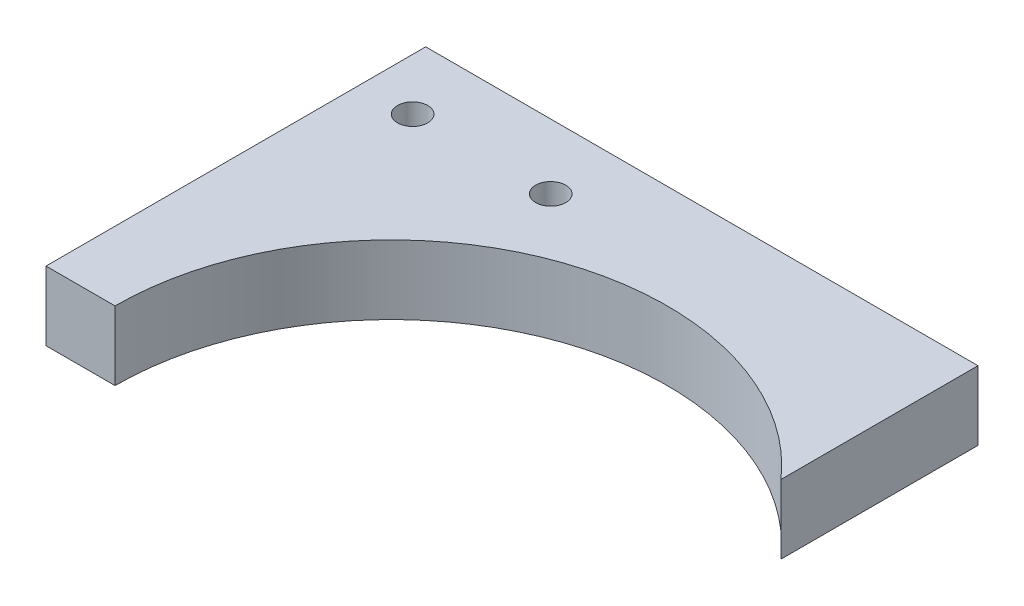
ISO-10303-21;
HEADER;
FILE_DESCRIPTION(('STEP AP214'),'2;1');
FILE_NAME('part.step','',(''),(''),'','','');
FILE_SCHEMA(('AUTOMOTIVE_DESIGN { 1 0 10303 214 1 1 1 1 }'));
ENDSEC;
DATA;
#1=APPLICATION_CONTEXT('core data for automotive mechanical design processes');
#2=APPLICATION_PROTOCOL_DEFINITION('international standard','automotive_design',2000,#1);
#3=PRODUCT_CONTEXT('',#1,'mechanical');
#4=PRODUCT('Part','Part','',(#3));
#5=PRODUCT_RELATED_PRODUCT_CATEGORY('part','',(#4));
#6=PRODUCT_DEFINITION_FORMATION('','',#4);
#7=PRODUCT_DEFINITION_CONTEXT('part definition',#1,'design');
#8=PRODUCT_DEFINITION('design','',#6,#7);
#9=PRODUCT_DEFINITION_SHAPE('','',#8);
#10=(LENGTH_UNIT() NAMED_UNIT(*) SI_UNIT(.MILLI.,.METRE.));
#11=(NAMED_UNIT(*) PLANE_ANGLE_UNIT() SI_UNIT($,.RADIAN.));
#12=(NAMED_UNIT(*) SI_UNIT($,.STERADIAN.) SOLID_ANGLE_UNIT());
#13=UNCERTAINTY_MEASURE_WITH_UNIT(LENGTH_MEASURE(1.E-05),#10,'distance_accuracy_value','');
#14=(GEOMETRIC_REPRESENTATION_CONTEXT(3) GLOBAL_UNCERTAINTY_ASSIGNED_CONTEXT((#13)) GLOBAL_UNIT_ASSIGNED_CONTEXT((#10,
#11,#12)) REPRESENTATION_CONTEXT('',''));
#15=CARTESIAN_POINT('',(0.,0.,0.));
#16=DIRECTION('',(0.,0.,1.));
#17=DIRECTION('',(1.,0.,0.));
#18=AXIS2_PLACEMENT_3D('',#15,#16,#17);
#19=CARTESIAN_POINT('',(0.,6.34999999999999,0.));
#20=DIRECTION('',(1.,0.,0.));
#21=DIRECTION('',(0.,0.,-1.));
#22=AXIS2_PLACEMENT_3D('',#19,#20,#21);
#23=PLANE('',#22);
#24=DIRECTION('',(0.,0.,1.));
#25=VECTOR('',#24,1.);
#26=CARTESIAN_POINT('',(0.,0.,0.));
#27=LINE('',#26,#25);
#28=CARTESIAN_POINT('',(0.,0.,-304.8));
#29=VERTEX_POINT('',#28);
#30=CARTESIAN_POINT('',(0.,0.,-269.875));
#31=VERTEX_POINT('',#30);
#32=EDGE_CURVE('E120',#29,#31,#27,.T.);
#33=ORIENTED_EDGE('',*,*,#32,.T.);
#34=DIRECTION('',(0.,1.,0.));
#35=VECTOR('',#34,1.);
#36=CARTESIAN_POINT('',(0.,0.,-269.875));
#37=LINE('',#36,#35);
#38=CARTESIAN_POINT('',(1.80411241501588E-13,6.34999999999999,-269.875000000001));
#39=VERTEX_POINT('',#38);
#40=EDGE_CURVE('E117',#31,#39,#37,.T.);
#41=ORIENTED_EDGE('',*,*,#40,.T.);
#42=DIRECTION('',(0.,0.,1.));
#43=VECTOR('',#42,1.);
#44=CARTESIAN_POINT('',(0.,6.34999999999999,0.));
#45=LINE('',#44,#43);
#46=CARTESIAN_POINT('',(1.80411241501588E-13,6.34999999999999,-304.800000000001));
#47=VERTEX_POINT('',#46);
#48=EDGE_CURVE('E122',#47,#39,#45,.T.);
#49=ORIENTED_EDGE('',*,*,#48,.F.);
#50=DIRECTION('',(0.,-1.,0.));
#51=VECTOR('',#50,1.);
#52=CARTESIAN_POINT('',(1.80411241501588E-13,6.34999999999999,-304.800000000001));
#53=LINE('',#52,#51);
#54=EDGE_CURVE('E55',#47,#29,#53,.T.);
#55=ORIENTED_EDGE('',*,*,#54,.T.);
#56=EDGE_LOOP('',(#33,#41,#49,#55));
#57=FACE_BOUND('',#56,.T.);
#58=ADVANCED_FACE('F48',(#57),#23,.F.);
#59=CARTESIAN_POINT('',(1.80411241501588E-13,6.34999999999999,-304.800000000001));
#60=DIRECTION('',(0.,0.,1.));
#61=DIRECTION('',(1.,0.,0.));
#62=AXIS2_PLACEMENT_3D('',#59,#60,#61);
#63=PLANE('',#62);
#64=DIRECTION('',(-1.,0.,0.));
#65=VECTOR('',#64,1.);
#66=CARTESIAN_POINT('',(1.80411241501588E-13,6.34999999999999,-304.800000000001));
#67=LINE('',#66,#65);
#68=CARTESIAN_POINT('',(50.8000000000003,6.34999999999972,-304.800000000001));
#69=VERTEX_POINT('',#68);
#70=EDGE_CURVE('E70',#69,#47,#67,.T.);
#71=ORIENTED_EDGE('',*,*,#70,.F.);
#72=DIRECTION('',(0.,1.,0.));
#73=VECTOR('',#72,1.);
#74=CARTESIAN_POINT('',(50.8000000000003,-3.05311331771918E-13,-304.8));
#75=LINE('',#74,#73);
#76=CARTESIAN_POINT('',(50.8000000000003,-3.05311331771918E-13,-304.8));
#77=VERTEX_POINT('',#76);
#78=EDGE_CURVE('E107',#77,#69,#75,.T.);
#79=ORIENTED_EDGE('',*,*,#78,.F.);
#80=DIRECTION('',(-1.,0.,0.));
#81=VECTOR('',#80,1.);
#82=CARTESIAN_POINT('',(0.,0.,-304.8));
#83=LINE('',#82,#81);
#84=EDGE_CURVE('E124',#77,#29,#83,.T.);
#85=ORIENTED_EDGE('',*,*,#84,.T.);
#86=ORIENTED_EDGE('',*,*,#54,.F.);
#87=EDGE_LOOP('',(#71,#79,#85,#86));
#88=FACE_BOUND('',#87,.T.);
#89=ADVANCED_FACE('F151',(#88),#63,.F.);
#90=CARTESIAN_POINT('',(0.,6.34999999999999,0.));
#91=DIRECTION('',(0.,-1.,0.));
#92=DIRECTION('',(0.,0.,-1.));
#93=AXIS2_PLACEMENT_3D('',#90,#91,#92);
#94=PLANE('',#93);
#95=CARTESIAN_POINT('',(4.7625,6.34999999999972,-298.833465881663));
#96=DIRECTION('',(0.,1.,0.));
#97=DIRECTION('',(0.,0.,1.));
#98=AXIS2_PLACEMENT_3D('',#95,#96,#97);
#99=CIRCLE('',#98,1.38906249999999);
#100=CARTESIAN_POINT('',(4.7625,6.34999999999972,-297.444403381664));
#101=VERTEX_POINT('',#100);
#102=EDGE_CURVE('E165',#101,#101,#99,.T.);
#103=ORIENTED_EDGE('',*,*,#102,.F.);
#104=EDGE_LOOP('',(#103));
#105=FACE_BOUND('',#104,.T.);
#106=CARTESIAN_POINT('',(17.4625,6.34999999999994,-298.833465881664));
#107=DIRECTION('',(0.,1.,0.));
#108=DIRECTION('',(0.,0.,1.));
#109=AXIS2_PLACEMENT_3D('',#106,#107,#108);
#110=CIRCLE('',#109,1.38906249999997);
#111=CARTESIAN_POINT('',(17.4625,6.34999999999994,-297.444403381664));
#112=VERTEX_POINT('',#111);
#113=EDGE_CURVE('E168',#112,#112,#110,.T.);
#114=ORIENTED_EDGE('',*,*,#113,.F.);
#115=EDGE_LOOP('',(#114));
#116=FACE_BOUND('',#115,.T.);
#117=DIRECTION('',(-1.,0.,0.));
#118=VECTOR('',#117,1.);
#119=CARTESIAN_POINT('',(50.8000000000003,6.34999999999972,-269.875000000001));
#120=LINE('',#119,#118);
#121=CARTESIAN_POINT('',(6.35000000000035,6.34999999999999,-269.875));
#122=VERTEX_POINT('',#121);
#123=EDGE_CURVE('E102',#122,#39,#120,.T.);
#124=ORIENTED_EDGE('',*,*,#123,.F.);
#125=CARTESIAN_POINT('',(31.7500000000004,6.34999999999999,-269.875000000001));
#126=DIRECTION('',(0.,1.,0.));
#127=DIRECTION('',(0.,0.,1.));
#128=AXIS2_PLACEMENT_3D('',#125,#126,#127);
#129=CIRCLE('',#128,25.4);
#130=CARTESIAN_POINT('',(50.8000000000003,6.34999999999969,-286.675520825261));
#131=VERTEX_POINT('',#130);
#132=EDGE_CURVE('E94',#131,#122,#129,.T.);
#133=ORIENTED_EDGE('',*,*,#132,.F.);
#134=DIRECTION('',(0.,0.,1.));
#135=VECTOR('',#134,1.);
#136=CARTESIAN_POINT('',(50.8000000000003,6.34999999999972,-304.800000000001));
#137=LINE('',#136,#135);
#138=EDGE_CURVE('E101',#69,#131,#137,.T.);
#139=ORIENTED_EDGE('',*,*,#138,.F.);
#140=ORIENTED_EDGE('',*,*,#70,.T.);
#141=ORIENTED_EDGE('',*,*,#48,.T.);
#142=EDGE_LOOP('',(#124,#133,#139,#140,#141));
#143=FACE_BOUND('',#142,.T.);
#144=ADVANCED_FACE('F100',(#105,#116,#143),#94,.F.);
#145=CARTESIAN_POINT('',(0.,0.,0.));
#146=DIRECTION('',(0.,-1.,0.));
#147=DIRECTION('',(0.,0.,-1.));
#148=AXIS2_PLACEMENT_3D('',#145,#146,#147);
#149=PLANE('',#148);
#150=CARTESIAN_POINT('',(4.76249999999973,-2.77555756156289E-13,-298.833465881663));
#151=DIRECTION('',(0.,1.,0.));
#152=DIRECTION('',(0.,0.,1.));
#153=AXIS2_PLACEMENT_3D('',#150,#151,#152);
#154=CIRCLE('',#153,1.38906249999999);
#155=CARTESIAN_POINT('',(4.76249999999973,-2.77555756156289E-13,-297.444403381664));
#156=VERTEX_POINT('',#155);
#157=EDGE_CURVE('E103',#156,#156,#154,.T.);
#158=ORIENTED_EDGE('',*,*,#157,.T.);
#159=EDGE_LOOP('',(#158));
#160=FACE_BOUND('',#159,.T.);
#161=CARTESIAN_POINT('',(17.4624999999997,0.,-298.833465881663));
#162=DIRECTION('',(0.,1.,0.));
#163=DIRECTION('',(0.,0.,1.));
#164=AXIS2_PLACEMENT_3D('',#161,#162,#163);
#165=CIRCLE('',#164,1.38906249999997);
#166=CARTESIAN_POINT('',(17.4624999999997,0.,-297.444403381664));
#167=VERTEX_POINT('',#166);
#168=EDGE_CURVE('E170',#167,#167,#165,.T.);
#169=ORIENTED_EDGE('',*,*,#168,.T.);
#170=EDGE_LOOP('',(#169));
#171=FACE_BOUND('',#170,.T.);
#172=CARTESIAN_POINT('',(31.7500000000004,0.,-269.875));
#173=DIRECTION('',(0.,1.,0.));
#174=DIRECTION('',(0.,0.,1.));
#175=AXIS2_PLACEMENT_3D('',#172,#173,#174);
#176=CIRCLE('',#175,25.4);
#177=CARTESIAN_POINT('',(50.8000000000003,-3.33066907387547E-13,-286.67552082526));
#178=VERTEX_POINT('',#177);
#179=CARTESIAN_POINT('',(6.35000000000035,0.,-269.875));
#180=VERTEX_POINT('',#179);
#181=EDGE_CURVE('E62',#178,#180,#176,.T.);
#182=ORIENTED_EDGE('',*,*,#181,.T.);
#183=DIRECTION('',(-1.,0.,0.));
#184=VECTOR('',#183,1.);
#185=CARTESIAN_POINT('',(50.8000000000003,-3.05311331771918E-13,-269.875));
#186=LINE('',#185,#184);
#187=EDGE_CURVE('E114',#180,#31,#186,.T.);
#188=ORIENTED_EDGE('',*,*,#187,.T.);
#189=ORIENTED_EDGE('',*,*,#32,.F.);
#190=ORIENTED_EDGE('',*,*,#84,.F.);
#191=DIRECTION('',(0.,0.,1.));
#192=VECTOR('',#191,1.);
#193=CARTESIAN_POINT('',(50.8000000000003,-3.05311331771918E-13,-304.8));
#194=LINE('',#193,#192);
#195=EDGE_CURVE('E110',#77,#178,#194,.T.);
#196=ORIENTED_EDGE('',*,*,#195,.T.);
#197=EDGE_LOOP('',(#182,#188,#189,#190,#196));
#198=FACE_BOUND('',#197,.T.);
#199=ADVANCED_FACE('F135',(#160,#171,#198),#149,.T.);
#200=CARTESIAN_POINT('',(50.8000000000003,-3.05311331771918E-13,-269.875));
#201=DIRECTION('',(0.,0.,-1.));
#202=DIRECTION('',(-1.,0.,0.));
#203=AXIS2_PLACEMENT_3D('',#200,#201,#202);
#204=PLANE('',#203);
#205=ORIENTED_EDGE('',*,*,#187,.F.);
#206=DIRECTION('',(0.,1.,0.));
#207=VECTOR('',#206,1.);
#208=CARTESIAN_POINT('',(6.35000000000035,0.,-269.875));
#209=LINE('',#208,#207);
#210=EDGE_CURVE('E108',#180,#122,#209,.T.);
#211=ORIENTED_EDGE('',*,*,#210,.T.);
#212=ORIENTED_EDGE('',*,*,#123,.T.);
#213=ORIENTED_EDGE('',*,*,#40,.F.);
#214=EDGE_LOOP('',(#205,#211,#212,#213));
#215=FACE_BOUND('',#214,.T.);
#216=ADVANCED_FACE('F139',(#215),#204,.F.);
#217=CARTESIAN_POINT('',(50.8000000000003,-3.05311331771918E-13,-304.8));
#218=DIRECTION('',(-1.,0.,0.));
#219=DIRECTION('',(0.,0.,1.));
#220=AXIS2_PLACEMENT_3D('',#217,#218,#219);
#221=PLANE('',#220);
#222=ORIENTED_EDGE('',*,*,#138,.T.);
#223=DIRECTION('',(0.,1.,0.));
#224=VECTOR('',#223,1.);
#225=CARTESIAN_POINT('',(50.8000000000003,-3.33066907387547E-13,-286.67552082526));
#226=LINE('',#225,#224);
#227=EDGE_CURVE('E13',#131,#178,#226,.F.);
#228=ORIENTED_EDGE('',*,*,#227,.T.);
#229=ORIENTED_EDGE('',*,*,#195,.F.);
#230=ORIENTED_EDGE('',*,*,#78,.T.);
#231=EDGE_LOOP('',(#222,#228,#229,#230));
#232=FACE_BOUND('',#231,.T.);
#233=ADVANCED_FACE('F105',(#232),#221,.F.);
#234=CARTESIAN_POINT('',(31.7500000000004,0.,-269.875));
#235=DIRECTION('',(0.,1.,0.));
#236=DIRECTION('',(0.,0.,1.));
#237=AXIS2_PLACEMENT_3D('',#234,#235,#236);
#238=CYLINDRICAL_SURFACE('',#237,25.4);
#239=ORIENTED_EDGE('',*,*,#181,.F.);
#240=ORIENTED_EDGE('',*,*,#227,.F.);
#241=ORIENTED_EDGE('',*,*,#132,.T.);
#242=ORIENTED_EDGE('',*,*,#210,.F.);
#243=EDGE_LOOP('',(#239,#240,#241,#242));
#244=FACE_BOUND('',#243,.T.);
#245=ADVANCED_FACE('F93',(#244),#238,.F.);
#246=CARTESIAN_POINT('',(17.4624999999997,0.,-298.833465881663));
#247=DIRECTION('',(0.,1.,0.));
#248=DIRECTION('',(0.,0.,1.));
#249=AXIS2_PLACEMENT_3D('',#246,#247,#248);
#250=CYLINDRICAL_SURFACE('',#249,1.38906249999997);
#251=ORIENTED_EDGE('',*,*,#168,.F.);
#252=EDGE_LOOP('',(#251));
#253=FACE_BOUND('',#252,.T.);
#254=ORIENTED_EDGE('',*,*,#113,.T.);
#255=EDGE_LOOP('',(#254));
#256=FACE_BOUND('',#255,.T.);
#257=ADVANCED_FACE('F184',(#253,#256),#250,.F.);
#258=CARTESIAN_POINT('',(4.76249999999973,-2.77555756156289E-13,-298.833465881663));
#259=DIRECTION('',(0.,1.,0.));
#260=DIRECTION('',(0.,0.,1.));
#261=AXIS2_PLACEMENT_3D('',#258,#259,#260);
#262=CYLINDRICAL_SURFACE('',#261,1.38906249999999);
#263=ORIENTED_EDGE('',*,*,#157,.F.);
#264=EDGE_LOOP('',(#263));
#265=FACE_BOUND('',#264,.T.);
#266=ORIENTED_EDGE('',*,*,#102,.T.);
#267=EDGE_LOOP('',(#266));
#268=FACE_BOUND('',#267,.T.);
#269=ADVANCED_FACE('F181',(#265,#268),#262,.F.);
#270=CLOSED_SHELL('',(#58,#89,#144,#199,#216,#233,#245,#257,#269));
#271=MANIFOLD_SOLID_BREP('B2',#270);
#272=ADVANCED_BREP_SHAPE_REPRESENTATION('',(#18,#271),#14);
#273=SHAPE_DEFINITION_REPRESENTATION(#9,#272);
ENDSEC;
END-ISO-10303-21;
